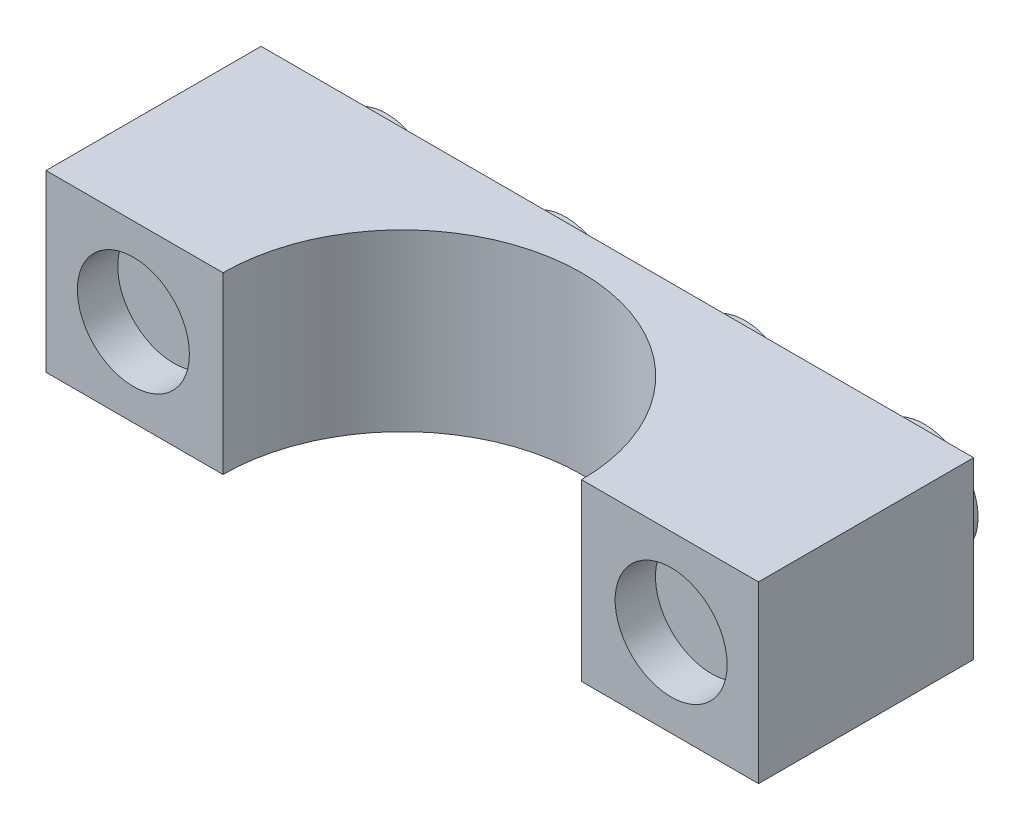
ISO-10303-21;
HEADER;
FILE_DESCRIPTION(('STEP AP214'),'2;1');
FILE_NAME('part.step','',(''),(''),'','','');
FILE_SCHEMA(('AUTOMOTIVE_DESIGN { 1 0 10303 214 1 1 1 1 }'));
ENDSEC;
DATA;
#1=APPLICATION_CONTEXT('core data for automotive mechanical design processes');
#2=APPLICATION_PROTOCOL_DEFINITION('international standard','automotive_design',2000,#1);
#3=PRODUCT_CONTEXT('',#1,'mechanical');
#4=PRODUCT('Part','Part','',(#3));
#5=PRODUCT_RELATED_PRODUCT_CATEGORY('part','',(#4));
#6=PRODUCT_DEFINITION_FORMATION('','',#4);
#7=PRODUCT_DEFINITION_CONTEXT('part definition',#1,'design');
#8=PRODUCT_DEFINITION('design','',#6,#7);
#9=PRODUCT_DEFINITION_SHAPE('','',#8);
#10=(LENGTH_UNIT() NAMED_UNIT(*) SI_UNIT(.MILLI.,.METRE.));
#11=(NAMED_UNIT(*) PLANE_ANGLE_UNIT() SI_UNIT($,.RADIAN.));
#12=(NAMED_UNIT(*) SI_UNIT($,.STERADIAN.) SOLID_ANGLE_UNIT());
#13=UNCERTAINTY_MEASURE_WITH_UNIT(LENGTH_MEASURE(1.E-05),#10,'distance_accuracy_value','');
#14=(GEOMETRIC_REPRESENTATION_CONTEXT(3) GLOBAL_UNCERTAINTY_ASSIGNED_CONTEXT((#13)) GLOBAL_UNIT_ASSIGNED_CONTEXT((#10,
#11,#12)) REPRESENTATION_CONTEXT('',''));
#15=CARTESIAN_POINT('',(0.,0.,0.));
#16=DIRECTION('',(0.,0.,1.));
#17=DIRECTION('',(1.,0.,0.));
#18=AXIS2_PLACEMENT_3D('',#15,#16,#17);
#19=CARTESIAN_POINT('',(0.,0.,9.6));
#20=DIRECTION('',(0.,0.,-1.));
#21=DIRECTION('',(-1.,0.,0.));
#22=AXIS2_PLACEMENT_3D('',#19,#20,#21);
#23=PLANE('',#22);
#24=CARTESIAN_POINT('',(12.,0.,9.6));
#25=DIRECTION('',(0.,0.,1.));
#26=DIRECTION('',(1.,0.,0.));
#27=AXIS2_PLACEMENT_3D('',#24,#25,#26);
#28=CIRCLE('',#27,2.5);
#29=CARTESIAN_POINT('',(14.5,0.,9.6));
#30=VERTEX_POINT('',#29);
#31=EDGE_CURVE('E243',#30,#30,#28,.T.);
#32=ORIENTED_EDGE('',*,*,#31,.F.);
#33=EDGE_LOOP('',(#32));
#34=FACE_BOUND('',#33,.T.);
#35=DIRECTION('',(-1.,0.,0.));
#36=VECTOR('',#35,1.);
#37=CARTESIAN_POINT('',(-15.9,3.9,9.6));
#38=LINE('',#37,#36);
#39=CARTESIAN_POINT('',(15.9,3.9,9.6));
#40=VERTEX_POINT('',#39);
#41=CARTESIAN_POINT('',(8.,3.9,9.6));
#42=VERTEX_POINT('',#41);
#43=EDGE_CURVE('E87',#40,#42,#38,.T.);
#44=ORIENTED_EDGE('',*,*,#43,.T.);
#45=DIRECTION('',(0.,-1.,0.));
#46=VECTOR('',#45,1.);
#47=CARTESIAN_POINT('',(8.,3.9,9.6));
#48=LINE('',#47,#46);
#49=CARTESIAN_POINT('',(8.,-3.9,9.6));
#50=VERTEX_POINT('',#49);
#51=EDGE_CURVE('E95',#42,#50,#48,.T.);
#52=ORIENTED_EDGE('',*,*,#51,.T.);
#53=DIRECTION('',(1.,0.,0.));
#54=VECTOR('',#53,1.);
#55=CARTESIAN_POINT('',(-15.9,-3.9,9.6));
#56=LINE('',#55,#54);
#57=CARTESIAN_POINT('',(15.9,-3.9,9.6));
#58=VERTEX_POINT('',#57);
#59=EDGE_CURVE('E59',#50,#58,#56,.T.);
#60=ORIENTED_EDGE('',*,*,#59,.T.);
#61=DIRECTION('',(0.,1.,0.));
#62=VECTOR('',#61,1.);
#63=CARTESIAN_POINT('',(15.9,-3.9,9.6));
#64=LINE('',#63,#62);
#65=EDGE_CURVE('E108',#58,#40,#64,.T.);
#66=ORIENTED_EDGE('',*,*,#65,.T.);
#67=EDGE_LOOP('',(#44,#52,#60,#66));
#68=FACE_BOUND('',#67,.T.);
#69=ADVANCED_FACE('F35',(#34,#68),#23,.F.);
#70=CARTESIAN_POINT('',(15.9,-3.9,9.6));
#71=DIRECTION('',(-1.,0.,0.));
#72=DIRECTION('',(0.,0.,1.));
#73=AXIS2_PLACEMENT_3D('',#70,#71,#72);
#74=PLANE('',#73);
#75=DIRECTION('',(0.,1.,0.));
#76=VECTOR('',#75,1.);
#77=CARTESIAN_POINT('',(15.9,-3.9,0.));
#78=LINE('',#77,#76);
#79=CARTESIAN_POINT('',(15.9,-3.9,0.));
#80=VERTEX_POINT('',#79);
#81=CARTESIAN_POINT('',(15.9,3.9,0.));
#82=VERTEX_POINT('',#81);
#83=EDGE_CURVE('E120',#80,#82,#78,.T.);
#84=ORIENTED_EDGE('',*,*,#83,.T.);
#85=DIRECTION('',(0.,0.,-1.));
#86=VECTOR('',#85,1.);
#87=CARTESIAN_POINT('',(15.9,3.9,9.6));
#88=LINE('',#87,#86);
#89=EDGE_CURVE('E11',#40,#82,#88,.T.);
#90=ORIENTED_EDGE('',*,*,#89,.F.);
#91=ORIENTED_EDGE('',*,*,#65,.F.);
#92=DIRECTION('',(0.,0.,-1.));
#93=VECTOR('',#92,1.);
#94=CARTESIAN_POINT('',(15.9,-3.9,9.6));
#95=LINE('',#94,#93);
#96=EDGE_CURVE('E119',#58,#80,#95,.T.);
#97=ORIENTED_EDGE('',*,*,#96,.T.);
#98=EDGE_LOOP('',(#84,#90,#91,#97));
#99=FACE_BOUND('',#98,.T.);
#100=ADVANCED_FACE('F37',(#99),#74,.F.);
#101=CARTESIAN_POINT('',(-15.9,3.9,9.6));
#102=DIRECTION('',(0.,-1.,0.));
#103=DIRECTION('',(0.,0.,-1.));
#104=AXIS2_PLACEMENT_3D('',#101,#102,#103);
#105=PLANE('',#104);
#106=CARTESIAN_POINT('',(-8.,3.9,9.6));
#107=VERTEX_POINT('',#106);
#108=CARTESIAN_POINT('',(-15.9,3.9,9.6));
#109=VERTEX_POINT('',#108);
#110=EDGE_CURVE('E105',#107,#109,#38,.T.);
#111=ORIENTED_EDGE('',*,*,#110,.F.);
#112=CARTESIAN_POINT('',(0.,3.9,9.6));
#113=DIRECTION('',(0.,-1.,0.));
#114=DIRECTION('',(0.,0.,-1.));
#115=AXIS2_PLACEMENT_3D('',#112,#113,#114);
#116=CIRCLE('',#115,8.);
#117=EDGE_CURVE('E50',#107,#42,#116,.T.);
#118=ORIENTED_EDGE('',*,*,#117,.T.);
#119=ORIENTED_EDGE('',*,*,#43,.F.);
#120=ORIENTED_EDGE('',*,*,#89,.T.);
#121=DIRECTION('',(-1.,0.,0.));
#122=VECTOR('',#121,1.);
#123=CARTESIAN_POINT('',(-15.9,3.9,0.));
#124=LINE('',#123,#122);
#125=CARTESIAN_POINT('',(-15.9,3.9,0.));
#126=VERTEX_POINT('',#125);
#127=EDGE_CURVE('E123',#82,#126,#124,.T.);
#128=ORIENTED_EDGE('',*,*,#127,.T.);
#129=DIRECTION('',(0.,0.,-1.));
#130=VECTOR('',#129,1.);
#131=CARTESIAN_POINT('',(-15.9,3.9,9.6));
#132=LINE('',#131,#130);
#133=EDGE_CURVE('E43',#109,#126,#132,.T.);
#134=ORIENTED_EDGE('',*,*,#133,.F.);
#135=EDGE_LOOP('',(#111,#118,#119,#120,#128,#134));
#136=FACE_BOUND('',#135,.T.);
#137=ADVANCED_FACE('F103',(#136),#105,.F.);
#138=CARTESIAN_POINT('',(-15.9,-3.9,9.6));
#139=DIRECTION('',(1.,0.,0.));
#140=DIRECTION('',(0.,0.,-1.));
#141=AXIS2_PLACEMENT_3D('',#138,#139,#140);
#142=PLANE('',#141);
#143=DIRECTION('',(0.,-1.,0.));
#144=VECTOR('',#143,1.);
#145=CARTESIAN_POINT('',(-15.9,-3.9,0.));
#146=LINE('',#145,#144);
#147=CARTESIAN_POINT('',(-15.9,-3.9,0.));
#148=VERTEX_POINT('',#147);
#149=EDGE_CURVE('E126',#126,#148,#146,.T.);
#150=ORIENTED_EDGE('',*,*,#149,.T.);
#151=DIRECTION('',(0.,0.,-1.));
#152=VECTOR('',#151,1.);
#153=CARTESIAN_POINT('',(-15.9,-3.9,9.6));
#154=LINE('',#153,#152);
#155=CARTESIAN_POINT('',(-15.9,-3.9,9.6));
#156=VERTEX_POINT('',#155);
#157=EDGE_CURVE('E130',#156,#148,#154,.T.);
#158=ORIENTED_EDGE('',*,*,#157,.F.);
#159=DIRECTION('',(0.,-1.,0.));
#160=VECTOR('',#159,1.);
#161=CARTESIAN_POINT('',(-15.9,-3.9,9.6));
#162=LINE('',#161,#160);
#163=EDGE_CURVE('E110',#109,#156,#162,.T.);
#164=ORIENTED_EDGE('',*,*,#163,.F.);
#165=ORIENTED_EDGE('',*,*,#133,.T.);
#166=EDGE_LOOP('',(#150,#158,#164,#165));
#167=FACE_BOUND('',#166,.T.);
#168=ADVANCED_FACE('F135',(#167),#142,.F.);
#169=CARTESIAN_POINT('',(-15.9,-3.9,9.6));
#170=DIRECTION('',(0.,1.,0.));
#171=DIRECTION('',(0.,0.,1.));
#172=AXIS2_PLACEMENT_3D('',#169,#170,#171);
#173=PLANE('',#172);
#174=ORIENTED_EDGE('',*,*,#59,.F.);
#175=CARTESIAN_POINT('',(0.,-3.9,9.6));
#176=DIRECTION('',(0.,-1.,0.));
#177=DIRECTION('',(0.,0.,-1.));
#178=AXIS2_PLACEMENT_3D('',#175,#176,#177);
#179=CIRCLE('',#178,8.);
#180=CARTESIAN_POINT('',(-8.,-3.9,9.6));
#181=VERTEX_POINT('',#180);
#182=EDGE_CURVE('E98',#181,#50,#179,.T.);
#183=ORIENTED_EDGE('',*,*,#182,.F.);
#184=EDGE_CURVE('E116',#156,#181,#56,.T.);
#185=ORIENTED_EDGE('',*,*,#184,.F.);
#186=ORIENTED_EDGE('',*,*,#157,.T.);
#187=DIRECTION('',(1.,0.,0.));
#188=VECTOR('',#187,1.);
#189=CARTESIAN_POINT('',(-15.9,-3.9,0.));
#190=LINE('',#189,#188);
#191=EDGE_CURVE('E81',#148,#80,#190,.T.);
#192=ORIENTED_EDGE('',*,*,#191,.T.);
#193=ORIENTED_EDGE('',*,*,#96,.F.);
#194=EDGE_LOOP('',(#174,#183,#185,#186,#192,#193));
#195=FACE_BOUND('',#194,.T.);
#196=ADVANCED_FACE('F141',(#195),#173,.F.);
#197=CARTESIAN_POINT('',(-12.,0.,9.6));
#198=DIRECTION('',(0.,0.,1.));
#199=DIRECTION('',(1.,0.,0.));
#200=AXIS2_PLACEMENT_3D('',#197,#198,#199);
#201=CIRCLE('',#200,2.5);
#202=CARTESIAN_POINT('',(-9.5,0.,9.6));
#203=VERTEX_POINT('',#202);
#204=EDGE_CURVE('E251',#203,#203,#201,.T.);
#205=ORIENTED_EDGE('',*,*,#204,.F.);
#206=EDGE_LOOP('',(#205));
#207=FACE_BOUND('',#206,.T.);
#208=ORIENTED_EDGE('',*,*,#184,.T.);
#209=DIRECTION('',(0.,-1.,0.));
#210=VECTOR('',#209,1.);
#211=CARTESIAN_POINT('',(-8.,3.9,9.6));
#212=LINE('',#211,#210);
#213=EDGE_CURVE('E100',#107,#181,#212,.T.);
#214=ORIENTED_EDGE('',*,*,#213,.F.);
#215=ORIENTED_EDGE('',*,*,#110,.T.);
#216=ORIENTED_EDGE('',*,*,#163,.T.);
#217=EDGE_LOOP('',(#208,#214,#215,#216));
#218=FACE_BOUND('',#217,.T.);
#219=ADVANCED_FACE('F146',(#207,#218),#23,.F.);
#220=CARTESIAN_POINT('',(0.,0.,0.));
#221=DIRECTION('',(0.,0.,-1.));
#222=DIRECTION('',(-1.,0.,0.));
#223=AXIS2_PLACEMENT_3D('',#220,#221,#222);
#224=PLANE('',#223);
#225=CARTESIAN_POINT('',(-12.,0.,0.));
#226=DIRECTION('',(0.,0.,-1.));
#227=DIRECTION('',(-1.,0.,0.));
#228=AXIS2_PLACEMENT_3D('',#225,#226,#227);
#229=CIRCLE('',#228,2.4);
#230=CARTESIAN_POINT('',(-14.4,0.,0.));
#231=VERTEX_POINT('',#230);
#232=EDGE_CURVE('E99',#231,#231,#229,.T.);
#233=ORIENTED_EDGE('',*,*,#232,.F.);
#234=EDGE_LOOP('',(#233));
#235=FACE_BOUND('',#234,.T.);
#236=CARTESIAN_POINT('',(-4.,0.,0.));
#237=DIRECTION('',(0.,0.,-1.));
#238=DIRECTION('',(-1.,0.,0.));
#239=AXIS2_PLACEMENT_3D('',#236,#237,#238);
#240=CIRCLE('',#239,2.4);
#241=CARTESIAN_POINT('',(-6.4,0.,0.));
#242=VERTEX_POINT('',#241);
#243=EDGE_CURVE('E152',#242,#242,#240,.T.);
#244=ORIENTED_EDGE('',*,*,#243,.F.);
#245=EDGE_LOOP('',(#244));
#246=FACE_BOUND('',#245,.T.);
#247=CARTESIAN_POINT('',(4.,0.,0.));
#248=DIRECTION('',(0.,0.,-1.));
#249=DIRECTION('',(-1.,0.,0.));
#250=AXIS2_PLACEMENT_3D('',#247,#248,#249);
#251=CIRCLE('',#250,2.4);
#252=CARTESIAN_POINT('',(1.6,0.,0.));
#253=VERTEX_POINT('',#252);
#254=EDGE_CURVE('E158',#253,#253,#251,.T.);
#255=ORIENTED_EDGE('',*,*,#254,.F.);
#256=EDGE_LOOP('',(#255));
#257=FACE_BOUND('',#256,.T.);
#258=CARTESIAN_POINT('',(12.,0.,0.));
#259=DIRECTION('',(0.,0.,-1.));
#260=DIRECTION('',(-1.,0.,0.));
#261=AXIS2_PLACEMENT_3D('',#258,#259,#260);
#262=CIRCLE('',#261,2.4);
#263=CARTESIAN_POINT('',(9.6,0.,0.));
#264=VERTEX_POINT('',#263);
#265=EDGE_CURVE('E164',#264,#264,#262,.T.);
#266=ORIENTED_EDGE('',*,*,#265,.F.);
#267=EDGE_LOOP('',(#266));
#268=FACE_BOUND('',#267,.T.);
#269=ORIENTED_EDGE('',*,*,#83,.F.);
#270=ORIENTED_EDGE('',*,*,#191,.F.);
#271=ORIENTED_EDGE('',*,*,#149,.F.);
#272=ORIENTED_EDGE('',*,*,#127,.F.);
#273=EDGE_LOOP('',(#269,#270,#271,#272));
#274=FACE_BOUND('',#273,.T.);
#275=ADVANCED_FACE('F139',(#235,#246,#257,#268,#274),#224,.T.);
#276=CARTESIAN_POINT('',(12.,0.,-1.7));
#277=DIRECTION('',(0.,0.,1.));
#278=DIRECTION('',(1.,0.,0.));
#279=AXIS2_PLACEMENT_3D('',#276,#277,#278);
#280=CYLINDRICAL_SURFACE('',#279,2.4);
#281=CARTESIAN_POINT('',(12.,0.,-1.7));
#282=DIRECTION('',(0.,0.,-1.));
#283=DIRECTION('',(-1.,0.,0.));
#284=AXIS2_PLACEMENT_3D('',#281,#282,#283);
#285=CIRCLE('',#284,2.4);
#286=CARTESIAN_POINT('',(9.6,0.,-1.7));
#287=VERTEX_POINT('',#286);
#288=EDGE_CURVE('E124',#287,#287,#285,.T.);
#289=ORIENTED_EDGE('',*,*,#288,.F.);
#290=EDGE_LOOP('',(#289));
#291=FACE_BOUND('',#290,.T.);
#292=ORIENTED_EDGE('',*,*,#265,.T.);
#293=EDGE_LOOP('',(#292));
#294=FACE_BOUND('',#293,.T.);
#295=ADVANCED_FACE('F171',(#291,#294),#280,.T.);
#296=CARTESIAN_POINT('',(12.,0.,-1.7));
#297=DIRECTION('',(0.,0.,-1.));
#298=DIRECTION('',(-1.,0.,0.));
#299=AXIS2_PLACEMENT_3D('',#296,#297,#298);
#300=PLANE('',#299);
#301=ORIENTED_EDGE('',*,*,#288,.T.);
#302=EDGE_LOOP('',(#301));
#303=FACE_BOUND('',#302,.T.);
#304=ADVANCED_FACE('F180',(#303),#300,.T.);
#305=CARTESIAN_POINT('',(4.,0.,-1.7));
#306=DIRECTION('',(0.,0.,1.));
#307=DIRECTION('',(1.,0.,0.));
#308=AXIS2_PLACEMENT_3D('',#305,#306,#307);
#309=CYLINDRICAL_SURFACE('',#308,2.4);
#310=CARTESIAN_POINT('',(4.,0.,-1.7));
#311=DIRECTION('',(0.,0.,-1.));
#312=DIRECTION('',(-1.,0.,0.));
#313=AXIS2_PLACEMENT_3D('',#310,#311,#312);
#314=CIRCLE('',#313,2.4);
#315=CARTESIAN_POINT('',(1.6,0.,-1.7));
#316=VERTEX_POINT('',#315);
#317=EDGE_CURVE('E161',#316,#316,#314,.T.);
#318=ORIENTED_EDGE('',*,*,#317,.F.);
#319=EDGE_LOOP('',(#318));
#320=FACE_BOUND('',#319,.T.);
#321=ORIENTED_EDGE('',*,*,#254,.T.);
#322=EDGE_LOOP('',(#321));
#323=FACE_BOUND('',#322,.T.);
#324=ADVANCED_FACE('F197',(#320,#323),#309,.T.);
#325=CARTESIAN_POINT('',(4.,0.,-1.7));
#326=DIRECTION('',(0.,0.,-1.));
#327=DIRECTION('',(-1.,0.,0.));
#328=AXIS2_PLACEMENT_3D('',#325,#326,#327);
#329=PLANE('',#328);
#330=ORIENTED_EDGE('',*,*,#317,.T.);
#331=EDGE_LOOP('',(#330));
#332=FACE_BOUND('',#331,.T.);
#333=ADVANCED_FACE('F201',(#332),#329,.T.);
#334=CARTESIAN_POINT('',(-4.,0.,-1.7));
#335=DIRECTION('',(0.,0.,1.));
#336=DIRECTION('',(1.,0.,0.));
#337=AXIS2_PLACEMENT_3D('',#334,#335,#336);
#338=CYLINDRICAL_SURFACE('',#337,2.4);
#339=CARTESIAN_POINT('',(-4.,0.,-1.7));
#340=DIRECTION('',(0.,0.,-1.));
#341=DIRECTION('',(-1.,0.,0.));
#342=AXIS2_PLACEMENT_3D('',#339,#340,#341);
#343=CIRCLE('',#342,2.4);
#344=CARTESIAN_POINT('',(-6.4,0.,-1.7));
#345=VERTEX_POINT('',#344);
#346=EDGE_CURVE('E155',#345,#345,#343,.T.);
#347=ORIENTED_EDGE('',*,*,#346,.F.);
#348=EDGE_LOOP('',(#347));
#349=FACE_BOUND('',#348,.T.);
#350=ORIENTED_EDGE('',*,*,#243,.T.);
#351=EDGE_LOOP('',(#350));
#352=FACE_BOUND('',#351,.T.);
#353=ADVANCED_FACE('F205',(#349,#352),#338,.T.);
#354=CARTESIAN_POINT('',(-4.,0.,-1.7));
#355=DIRECTION('',(0.,0.,-1.));
#356=DIRECTION('',(-1.,0.,0.));
#357=AXIS2_PLACEMENT_3D('',#354,#355,#356);
#358=PLANE('',#357);
#359=ORIENTED_EDGE('',*,*,#346,.T.);
#360=EDGE_LOOP('',(#359));
#361=FACE_BOUND('',#360,.T.);
#362=ADVANCED_FACE('F209',(#361),#358,.T.);
#363=CARTESIAN_POINT('',(-12.,0.,-1.7));
#364=DIRECTION('',(0.,0.,1.));
#365=DIRECTION('',(1.,0.,0.));
#366=AXIS2_PLACEMENT_3D('',#363,#364,#365);
#367=CYLINDRICAL_SURFACE('',#366,2.4);
#368=CARTESIAN_POINT('',(-12.,0.,-1.7));
#369=DIRECTION('',(0.,0.,-1.));
#370=DIRECTION('',(-1.,0.,0.));
#371=AXIS2_PLACEMENT_3D('',#368,#369,#370);
#372=CIRCLE('',#371,2.4);
#373=CARTESIAN_POINT('',(-14.4,0.,-1.7));
#374=VERTEX_POINT('',#373);
#375=EDGE_CURVE('E149',#374,#374,#372,.T.);
#376=ORIENTED_EDGE('',*,*,#375,.F.);
#377=EDGE_LOOP('',(#376));
#378=FACE_BOUND('',#377,.T.);
#379=ORIENTED_EDGE('',*,*,#232,.T.);
#380=EDGE_LOOP('',(#379));
#381=FACE_BOUND('',#380,.T.);
#382=ADVANCED_FACE('F213',(#378,#381),#367,.T.);
#383=CARTESIAN_POINT('',(-12.,0.,-1.7));
#384=DIRECTION('',(0.,0.,-1.));
#385=DIRECTION('',(-1.,0.,0.));
#386=AXIS2_PLACEMENT_3D('',#383,#384,#385);
#387=PLANE('',#386);
#388=ORIENTED_EDGE('',*,*,#375,.T.);
#389=EDGE_LOOP('',(#388));
#390=FACE_BOUND('',#389,.T.);
#391=ADVANCED_FACE('F217',(#390),#387,.T.);
#392=CARTESIAN_POINT('',(0.,3.9,9.6));
#393=DIRECTION('',(0.,-1.,0.));
#394=DIRECTION('',(0.,0.,-1.));
#395=AXIS2_PLACEMENT_3D('',#392,#393,#394);
#396=CYLINDRICAL_SURFACE('',#395,8.);
#397=ORIENTED_EDGE('',*,*,#182,.T.);
#398=ORIENTED_EDGE('',*,*,#51,.F.);
#399=ORIENTED_EDGE('',*,*,#117,.F.);
#400=ORIENTED_EDGE('',*,*,#213,.T.);
#401=EDGE_LOOP('',(#397,#398,#399,#400));
#402=FACE_BOUND('',#401,.T.);
#403=ADVANCED_FACE('F96',(#402),#396,.F.);
#404=CARTESIAN_POINT('',(-12.,0.,7.8));
#405=DIRECTION('',(0.,0.,1.));
#406=DIRECTION('',(1.,0.,0.));
#407=AXIS2_PLACEMENT_3D('',#404,#405,#406);
#408=CYLINDRICAL_SURFACE('',#407,2.5);
#409=CARTESIAN_POINT('',(-12.,0.,7.8));
#410=DIRECTION('',(0.,0.,1.));
#411=DIRECTION('',(1.,0.,0.));
#412=AXIS2_PLACEMENT_3D('',#409,#410,#411);
#413=CIRCLE('',#412,2.5);
#414=CARTESIAN_POINT('',(-9.5,0.,7.8));
#415=VERTEX_POINT('',#414);
#416=EDGE_CURVE('E246',#415,#415,#413,.T.);
#417=ORIENTED_EDGE('',*,*,#416,.F.);
#418=EDGE_LOOP('',(#417));
#419=FACE_BOUND('',#418,.T.);
#420=ORIENTED_EDGE('',*,*,#204,.T.);
#421=EDGE_LOOP('',(#420));
#422=FACE_BOUND('',#421,.T.);
#423=ADVANCED_FACE('F224',(#419,#422),#408,.F.);
#424=CARTESIAN_POINT('',(-12.,0.,7.8));
#425=DIRECTION('',(0.,0.,1.));
#426=DIRECTION('',(1.,0.,0.));
#427=AXIS2_PLACEMENT_3D('',#424,#425,#426);
#428=PLANE('',#427);
#429=ORIENTED_EDGE('',*,*,#416,.T.);
#430=EDGE_LOOP('',(#429));
#431=FACE_BOUND('',#430,.T.);
#432=ADVANCED_FACE('F227',(#431),#428,.T.);
#433=CARTESIAN_POINT('',(12.,0.,7.8));
#434=DIRECTION('',(0.,0.,1.));
#435=DIRECTION('',(1.,0.,0.));
#436=AXIS2_PLACEMENT_3D('',#433,#434,#435);
#437=CYLINDRICAL_SURFACE('',#436,2.5);
#438=CARTESIAN_POINT('',(12.,0.,7.8));
#439=DIRECTION('',(0.,0.,1.));
#440=DIRECTION('',(1.,0.,0.));
#441=AXIS2_PLACEMENT_3D('',#438,#439,#440);
#442=CIRCLE('',#441,2.5);
#443=CARTESIAN_POINT('',(14.5,0.,7.8));
#444=VERTEX_POINT('',#443);
#445=EDGE_CURVE('E143',#444,#444,#442,.T.);
#446=ORIENTED_EDGE('',*,*,#445,.F.);
#447=EDGE_LOOP('',(#446));
#448=FACE_BOUND('',#447,.T.);
#449=ORIENTED_EDGE('',*,*,#31,.T.);
#450=EDGE_LOOP('',(#449));
#451=FACE_BOUND('',#450,.T.);
#452=ADVANCED_FACE('F231',(#448,#451),#437,.F.);
#453=CARTESIAN_POINT('',(12.,0.,7.8));
#454=DIRECTION('',(0.,0.,1.));
#455=DIRECTION('',(1.,0.,0.));
#456=AXIS2_PLACEMENT_3D('',#453,#454,#455);
#457=PLANE('',#456);
#458=ORIENTED_EDGE('',*,*,#445,.T.);
#459=EDGE_LOOP('',(#458));
#460=FACE_BOUND('',#459,.T.);
#461=ADVANCED_FACE('F235',(#460),#457,.T.);
#462=CLOSED_SHELL('',(#69,#100,#137,#168,#196,#219,#275,#295,#304,#324,#333,#353,#362,#382,#391,
#403,#423,#432,#452,#461));
#463=MANIFOLD_SOLID_BREP('B2',#462);
#464=ADVANCED_BREP_SHAPE_REPRESENTATION('',(#18,#463),#14);
#465=SHAPE_DEFINITION_REPRESENTATION(#9,#464);
ENDSEC;
END-ISO-10303-21;
